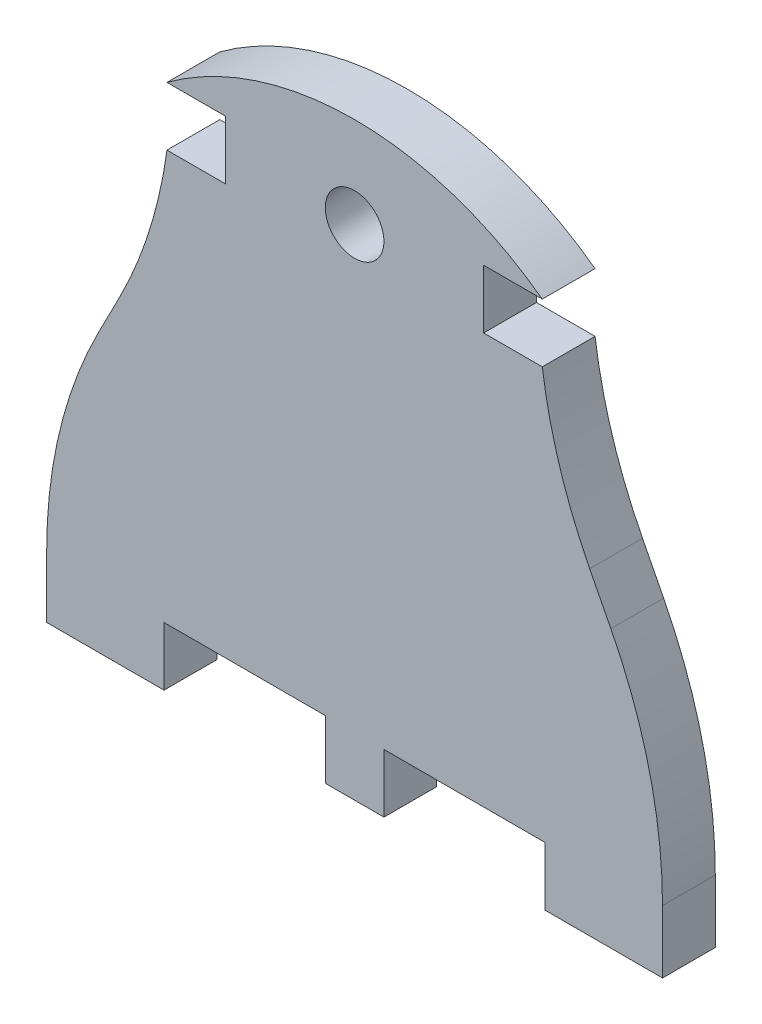
ISO-10303-21;
HEADER;
FILE_DESCRIPTION(('STEP AP214'),'2;1');
FILE_NAME('part.step','',(''),(''),'','','');
FILE_SCHEMA(('AUTOMOTIVE_DESIGN { 1 0 10303 214 1 1 1 1 }'));
ENDSEC;
DATA;
#1=APPLICATION_CONTEXT('core data for automotive mechanical design processes');
#2=APPLICATION_PROTOCOL_DEFINITION('international standard','automotive_design',2000,#1);
#3=PRODUCT_CONTEXT('',#1,'mechanical');
#4=PRODUCT('Part','Part','',(#3));
#5=PRODUCT_RELATED_PRODUCT_CATEGORY('part','',(#4));
#6=PRODUCT_DEFINITION_FORMATION('','',#4);
#7=PRODUCT_DEFINITION_CONTEXT('part definition',#1,'design');
#8=PRODUCT_DEFINITION('design','',#6,#7);
#9=PRODUCT_DEFINITION_SHAPE('','',#8);
#10=(LENGTH_UNIT() NAMED_UNIT(*) SI_UNIT(.MILLI.,.METRE.));
#11=(NAMED_UNIT(*) PLANE_ANGLE_UNIT() SI_UNIT($,.RADIAN.));
#12=(NAMED_UNIT(*) SI_UNIT($,.STERADIAN.) SOLID_ANGLE_UNIT());
#13=UNCERTAINTY_MEASURE_WITH_UNIT(LENGTH_MEASURE(1.E-05),#10,'distance_accuracy_value','');
#14=(GEOMETRIC_REPRESENTATION_CONTEXT(3) GLOBAL_UNCERTAINTY_ASSIGNED_CONTEXT((#13)) GLOBAL_UNIT_ASSIGNED_CONTEXT((#10,
#11,#12)) REPRESENTATION_CONTEXT('',''));
#15=CARTESIAN_POINT('',(0.,0.,0.));
#16=DIRECTION('',(0.,0.,1.));
#17=DIRECTION('',(1.,0.,0.));
#18=AXIS2_PLACEMENT_3D('',#15,#16,#17);
#19=CARTESIAN_POINT('',(0.,0.,4.5));
#20=DIRECTION('',(0.,0.,1.));
#21=DIRECTION('',(1.,0.,0.));
#22=AXIS2_PLACEMENT_3D('',#19,#20,#21);
#23=PLANE('',#22);
#24=CARTESIAN_POINT('',(0.,53.2123706585382,4.5));
#25=DIRECTION('',(0.,0.,1.));
#26=DIRECTION('',(1.,0.,0.));
#27=AXIS2_PLACEMENT_3D('',#24,#25,#26);
#28=CIRCLE('',#27,2.5);
#29=CARTESIAN_POINT('',(2.5,53.2123706585382,4.5));
#30=VERTEX_POINT('',#29);
#31=EDGE_CURVE('E285',#30,#30,#28,.T.);
#32=ORIENTED_EDGE('',*,*,#31,.F.);
#33=EDGE_LOOP('',(#32));
#34=FACE_BOUND('',#33,.T.);
#35=CARTESIAN_POINT('',(0.,33.9910697322237,4.5));
#36=DIRECTION('',(0.,0.,-1.));
#37=DIRECTION('',(-1.,0.,0.));
#38=AXIS2_PLACEMENT_3D('',#35,#36,#37);
#39=CIRCLE('',#38,26.9714919574501);
#40=CARTESIAN_POINT('',(-16.,55.7042311420875,4.5));
#41=VERTEX_POINT('',#40);
#42=CARTESIAN_POINT('',(16.,55.7042311420875,4.5));
#43=VERTEX_POINT('',#42);
#44=EDGE_CURVE('E200',#41,#43,#39,.T.);
#45=ORIENTED_EDGE('',*,*,#44,.F.);
#46=DIRECTION('',(-1.,0.,0.));
#47=VECTOR('',#46,1.);
#48=CARTESIAN_POINT('',(0.,55.7042311420875,4.5));
#49=LINE('',#48,#47);
#50=CARTESIAN_POINT('',(-11.,55.7042311420875,4.5));
#51=VERTEX_POINT('',#50);
#52=EDGE_CURVE('E214',#51,#41,#49,.T.);
#53=ORIENTED_EDGE('',*,*,#52,.F.);
#54=DIRECTION('',(0.,1.,0.));
#55=VECTOR('',#54,1.);
#56=CARTESIAN_POINT('',(-11.,0.,4.5));
#57=LINE('',#56,#55);
#58=CARTESIAN_POINT('',(-11.,50.7042311420875,4.5));
#59=VERTEX_POINT('',#58);
#60=EDGE_CURVE('E221',#59,#51,#57,.T.);
#61=ORIENTED_EDGE('',*,*,#60,.F.);
#62=DIRECTION('',(1.,0.,0.));
#63=VECTOR('',#62,1.);
#64=CARTESIAN_POINT('',(0.,50.7042311420875,4.5));
#65=LINE('',#64,#63);
#66=CARTESIAN_POINT('',(-16.,50.7042311420875,4.5));
#67=VERTEX_POINT('',#66);
#68=EDGE_CURVE('E223',#67,#59,#65,.T.);
#69=ORIENTED_EDGE('',*,*,#68,.F.);
#70=CARTESIAN_POINT('',(-55.63981281636,56.0600914729717,4.5));
#71=DIRECTION('',(0.,0.,1.));
#72=DIRECTION('',(1.,0.,0.));
#73=AXIS2_PLACEMENT_3D('',#70,#71,#72);
#74=CIRCLE('',#73,40.);
#75=CARTESIAN_POINT('',(-20.042482794085,37.8164598365558,4.5));
#76=VERTEX_POINT('',#75);
#77=EDGE_CURVE('E341',#67,#76,#74,.F.);
#78=ORIENTED_EDGE('',*,*,#77,.T.);
#79=DIRECTION('',(0.456090790910399,0.889933250556876,0.));
#80=VECTOR('',#79,1.);
#81=CARTESIAN_POINT('',(-31.2226058836836,16.0015855153878,4.5));
#82=LINE('',#81,#80);
#83=CARTESIAN_POINT('',(-21.847330022275,34.2948067083801,4.5));
#84=VERTEX_POINT('',#83);
#85=EDGE_CURVE('E231',#84,#76,#82,.T.);
#86=ORIENTED_EDGE('',*,*,#85,.F.);
#87=CARTESIAN_POINT('',(13.75,16.0511750719641,4.5));
#88=DIRECTION('',(0.,0.,1.));
#89=DIRECTION('',(1.,0.,0.));
#90=AXIS2_PLACEMENT_3D('',#87,#88,#89);
#91=CIRCLE('',#90,40.);
#92=CARTESIAN_POINT('',(-26.25,16.0511750719641,4.5));
#93=VERTEX_POINT('',#92);
#94=EDGE_CURVE('E330',#84,#93,#91,.T.);
#95=ORIENTED_EDGE('',*,*,#94,.T.);
#96=DIRECTION('',(0.,1.,0.));
#97=VECTOR('',#96,1.);
#98=CARTESIAN_POINT('',(-26.25,0.,4.5));
#99=LINE('',#98,#97);
#100=CARTESIAN_POINT('',(-26.25,10.7042311420875,4.5));
#101=VERTEX_POINT('',#100);
#102=EDGE_CURVE('E234',#101,#93,#99,.T.);
#103=ORIENTED_EDGE('',*,*,#102,.F.);
#104=DIRECTION('',(1.,0.,0.));
#105=VECTOR('',#104,1.);
#106=CARTESIAN_POINT('',(0.,10.7042311420875,4.5));
#107=LINE('',#106,#105);
#108=CARTESIAN_POINT('',(-16.25,10.7042311420875,4.5));
#109=VERTEX_POINT('',#108);
#110=EDGE_CURVE('E237',#101,#109,#107,.T.);
#111=ORIENTED_EDGE('',*,*,#110,.T.);
#112=DIRECTION('',(0.,1.,0.));
#113=VECTOR('',#112,1.);
#114=CARTESIAN_POINT('',(-16.25,0.,4.5));
#115=LINE('',#114,#113);
#116=CARTESIAN_POINT('',(-16.25,15.7042311420875,4.5));
#117=VERTEX_POINT('',#116);
#118=EDGE_CURVE('E378',#109,#117,#115,.T.);
#119=ORIENTED_EDGE('',*,*,#118,.T.);
#120=DIRECTION('',(1.,0.,0.));
#121=VECTOR('',#120,1.);
#122=CARTESIAN_POINT('',(0.,15.7042311420875,4.5));
#123=LINE('',#122,#121);
#124=CARTESIAN_POINT('',(-2.5,15.7042311420875,4.5));
#125=VERTEX_POINT('',#124);
#126=EDGE_CURVE('E376',#117,#125,#123,.T.);
#127=ORIENTED_EDGE('',*,*,#126,.T.);
#128=DIRECTION('',(0.,1.,0.));
#129=VECTOR('',#128,1.);
#130=CARTESIAN_POINT('',(-2.5,10.7042311420875,4.5));
#131=LINE('',#130,#129);
#132=CARTESIAN_POINT('',(-2.5,10.7042311420875,4.5));
#133=VERTEX_POINT('',#132);
#134=EDGE_CURVE('E384',#133,#125,#131,.T.);
#135=ORIENTED_EDGE('',*,*,#134,.F.);
#136=DIRECTION('',(-1.,0.,0.));
#137=VECTOR('',#136,1.);
#138=CARTESIAN_POINT('',(-2.5,10.7042311420875,4.5));
#139=LINE('',#138,#137);
#140=CARTESIAN_POINT('',(2.5,10.7042311420875,4.5));
#141=VERTEX_POINT('',#140);
#142=EDGE_CURVE('E402',#141,#133,#139,.T.);
#143=ORIENTED_EDGE('',*,*,#142,.F.);
#144=DIRECTION('',(0.,1.,0.));
#145=VECTOR('',#144,1.);
#146=CARTESIAN_POINT('',(2.5,10.7042311420875,4.5));
#147=LINE('',#146,#145);
#148=CARTESIAN_POINT('',(2.5,15.7042311420875,4.5));
#149=VERTEX_POINT('',#148);
#150=EDGE_CURVE('E244',#141,#149,#147,.T.);
#151=ORIENTED_EDGE('',*,*,#150,.T.);
#152=CARTESIAN_POINT('',(16.25,15.7042311420875,4.5));
#153=VERTEX_POINT('',#152);
#154=EDGE_CURVE('E52',#149,#153,#123,.T.);
#155=ORIENTED_EDGE('',*,*,#154,.T.);
#156=DIRECTION('',(0.,1.,0.));
#157=VECTOR('',#156,1.);
#158=CARTESIAN_POINT('',(16.25,0.,4.5));
#159=LINE('',#158,#157);
#160=CARTESIAN_POINT('',(16.25,10.7042311420875,4.5));
#161=VERTEX_POINT('',#160);
#162=EDGE_CURVE('E373',#161,#153,#159,.T.);
#163=ORIENTED_EDGE('',*,*,#162,.F.);
#164=DIRECTION('',(-1.,0.,0.));
#165=VECTOR('',#164,1.);
#166=CARTESIAN_POINT('',(0.,10.7042311420875,4.5));
#167=LINE('',#166,#165);
#168=CARTESIAN_POINT('',(26.25,10.7042311420875,4.5));
#169=VERTEX_POINT('',#168);
#170=EDGE_CURVE('E370',#169,#161,#167,.T.);
#171=ORIENTED_EDGE('',*,*,#170,.F.);
#172=DIRECTION('',(0.,1.,0.));
#173=VECTOR('',#172,1.);
#174=CARTESIAN_POINT('',(26.25,0.,4.5));
#175=LINE('',#174,#173);
#176=CARTESIAN_POINT('',(26.25,16.0511750719641,4.5));
#177=VERTEX_POINT('',#176);
#178=EDGE_CURVE('E365',#169,#177,#175,.T.);
#179=ORIENTED_EDGE('',*,*,#178,.T.);
#180=CARTESIAN_POINT('',(-13.75,16.0511750719641,4.5));
#181=DIRECTION('',(0.,0.,1.));
#182=DIRECTION('',(1.,0.,0.));
#183=AXIS2_PLACEMENT_3D('',#180,#181,#182);
#184=CIRCLE('',#183,40.);
#185=CARTESIAN_POINT('',(21.847330022275,34.2948067083801,4.5));
#186=VERTEX_POINT('',#185);
#187=EDGE_CURVE('E328',#177,#186,#184,.T.);
#188=ORIENTED_EDGE('',*,*,#187,.T.);
#189=DIRECTION('',(-0.456090790910399,0.889933250556876,0.));
#190=VECTOR('',#189,1.);
#191=CARTESIAN_POINT('',(31.2226058836836,16.0015855153878,4.5));
#192=LINE('',#191,#190);
#193=CARTESIAN_POINT('',(20.042482794085,37.8164598365558,4.5));
#194=VERTEX_POINT('',#193);
#195=EDGE_CURVE('E360',#186,#194,#192,.T.);
#196=ORIENTED_EDGE('',*,*,#195,.T.);
#197=CARTESIAN_POINT('',(55.63981281636,56.0600914729717,4.5));
#198=DIRECTION('',(0.,0.,1.));
#199=DIRECTION('',(1.,0.,0.));
#200=AXIS2_PLACEMENT_3D('',#197,#198,#199);
#201=CIRCLE('',#200,40.);
#202=CARTESIAN_POINT('',(16.,50.7042311420875,4.5));
#203=VERTEX_POINT('',#202);
#204=EDGE_CURVE('E11',#194,#203,#201,.F.);
#205=ORIENTED_EDGE('',*,*,#204,.T.);
#206=DIRECTION('',(-1.,0.,0.));
#207=VECTOR('',#206,1.);
#208=CARTESIAN_POINT('',(0.,50.7042311420875,4.5));
#209=LINE('',#208,#207);
#210=CARTESIAN_POINT('',(11.,50.7042311420875,4.5));
#211=VERTEX_POINT('',#210);
#212=EDGE_CURVE('E358',#203,#211,#209,.T.);
#213=ORIENTED_EDGE('',*,*,#212,.T.);
#214=DIRECTION('',(0.,1.,0.));
#215=VECTOR('',#214,1.);
#216=CARTESIAN_POINT('',(11.,0.,4.5));
#217=LINE('',#216,#215);
#218=CARTESIAN_POINT('',(11.,55.7042311420875,4.5));
#219=VERTEX_POINT('',#218);
#220=EDGE_CURVE('E225',#211,#219,#217,.T.);
#221=ORIENTED_EDGE('',*,*,#220,.T.);
#222=DIRECTION('',(1.,0.,0.));
#223=VECTOR('',#222,1.);
#224=CARTESIAN_POINT('',(0.,55.7042311420875,4.5));
#225=LINE('',#224,#223);
#226=EDGE_CURVE('E217',#219,#43,#225,.T.);
#227=ORIENTED_EDGE('',*,*,#226,.T.);
#228=EDGE_LOOP('',(#45,#53,#61,#69,#78,#86,#95,#103,#111,#119,#127,#135,#143,#151,#155,#163,
#171,#179,#188,#196,#205,#213,#221,#227));
#229=FACE_BOUND('',#228,.T.);
#230=ADVANCED_FACE('F37',(#34,#229),#23,.T.);
#231=CARTESIAN_POINT('',(0.,0.,0.));
#232=DIRECTION('',(0.,0.,1.));
#233=DIRECTION('',(1.,0.,0.));
#234=AXIS2_PLACEMENT_3D('',#231,#232,#233);
#235=PLANE('',#234);
#236=CARTESIAN_POINT('',(0.,53.2123706585382,0.));
#237=DIRECTION('',(0.,0.,1.));
#238=DIRECTION('',(1.,0.,0.));
#239=AXIS2_PLACEMENT_3D('',#236,#237,#238);
#240=CIRCLE('',#239,2.5);
#241=CARTESIAN_POINT('',(2.5,53.2123706585382,0.));
#242=VERTEX_POINT('',#241);
#243=EDGE_CURVE('E240',#242,#242,#240,.T.);
#244=ORIENTED_EDGE('',*,*,#243,.T.);
#245=EDGE_LOOP('',(#244));
#246=FACE_BOUND('',#245,.T.);
#247=DIRECTION('',(-1.,0.,0.));
#248=VECTOR('',#247,1.);
#249=CARTESIAN_POINT('',(0.,55.7042311420875,0.));
#250=LINE('',#249,#248);
#251=CARTESIAN_POINT('',(-11.,55.7042311420875,0.));
#252=VERTEX_POINT('',#251);
#253=CARTESIAN_POINT('',(-16.,55.7042311420875,0.));
#254=VERTEX_POINT('',#253);
#255=EDGE_CURVE('E269',#252,#254,#250,.T.);
#256=ORIENTED_EDGE('',*,*,#255,.T.);
#257=CARTESIAN_POINT('',(0.,33.9910697322237,0.));
#258=DIRECTION('',(0.,0.,1.));
#259=DIRECTION('',(1.,0.,0.));
#260=AXIS2_PLACEMENT_3D('',#257,#258,#259);
#261=CIRCLE('',#260,26.9714919574501);
#262=CARTESIAN_POINT('',(16.,55.7042311420874,0.));
#263=VERTEX_POINT('',#262);
#264=EDGE_CURVE('E203',#254,#263,#261,.F.);
#265=ORIENTED_EDGE('',*,*,#264,.T.);
#266=DIRECTION('',(1.,0.,0.));
#267=VECTOR('',#266,1.);
#268=CARTESIAN_POINT('',(0.,55.7042311420875,0.));
#269=LINE('',#268,#267);
#270=CARTESIAN_POINT('',(11.,55.7042311420875,0.));
#271=VERTEX_POINT('',#270);
#272=EDGE_CURVE('E266',#271,#263,#269,.T.);
#273=ORIENTED_EDGE('',*,*,#272,.F.);
#274=DIRECTION('',(0.,1.,0.));
#275=VECTOR('',#274,1.);
#276=CARTESIAN_POINT('',(11.,0.,0.));
#277=LINE('',#276,#275);
#278=CARTESIAN_POINT('',(11.,50.7042311420875,0.));
#279=VERTEX_POINT('',#278);
#280=EDGE_CURVE('E264',#279,#271,#277,.T.);
#281=ORIENTED_EDGE('',*,*,#280,.F.);
#282=DIRECTION('',(-1.,0.,0.));
#283=VECTOR('',#282,1.);
#284=CARTESIAN_POINT('',(0.,50.7042311420875,0.));
#285=LINE('',#284,#283);
#286=CARTESIAN_POINT('',(16.,50.7042311420875,0.));
#287=VERTEX_POINT('',#286);
#288=EDGE_CURVE('E262',#287,#279,#285,.T.);
#289=ORIENTED_EDGE('',*,*,#288,.F.);
#290=CARTESIAN_POINT('',(55.63981281636,56.0600914729717,0.));
#291=DIRECTION('',(0.,0.,1.));
#292=DIRECTION('',(1.,0.,0.));
#293=AXIS2_PLACEMENT_3D('',#290,#291,#292);
#294=CIRCLE('',#293,40.);
#295=CARTESIAN_POINT('',(20.042482794085,37.8164598365558,0.));
#296=VERTEX_POINT('',#295);
#297=EDGE_CURVE('E45',#287,#296,#294,.T.);
#298=ORIENTED_EDGE('',*,*,#297,.T.);
#299=DIRECTION('',(-0.456090790910399,0.889933250556876,0.));
#300=VECTOR('',#299,1.);
#301=CARTESIAN_POINT('',(31.2226058836836,16.0015855153878,0.));
#302=LINE('',#301,#300);
#303=CARTESIAN_POINT('',(21.847330022275,34.2948067083801,0.));
#304=VERTEX_POINT('',#303);
#305=EDGE_CURVE('E259',#304,#296,#302,.T.);
#306=ORIENTED_EDGE('',*,*,#305,.F.);
#307=CARTESIAN_POINT('',(-13.75,16.0511750719641,0.));
#308=DIRECTION('',(0.,0.,1.));
#309=DIRECTION('',(1.,0.,0.));
#310=AXIS2_PLACEMENT_3D('',#307,#308,#309);
#311=CIRCLE('',#310,40.);
#312=CARTESIAN_POINT('',(26.25,16.0511750719641,0.));
#313=VERTEX_POINT('',#312);
#314=EDGE_CURVE('E324',#304,#313,#311,.F.);
#315=ORIENTED_EDGE('',*,*,#314,.T.);
#316=DIRECTION('',(0.,1.,0.));
#317=VECTOR('',#316,1.);
#318=CARTESIAN_POINT('',(26.25,0.,0.));
#319=LINE('',#318,#317);
#320=CARTESIAN_POINT('',(26.25,10.7042311420875,0.));
#321=VERTEX_POINT('',#320);
#322=EDGE_CURVE('E256',#321,#313,#319,.T.);
#323=ORIENTED_EDGE('',*,*,#322,.F.);
#324=DIRECTION('',(-1.,0.,0.));
#325=VECTOR('',#324,1.);
#326=CARTESIAN_POINT('',(0.,10.7042311420875,0.));
#327=LINE('',#326,#325);
#328=CARTESIAN_POINT('',(16.25,10.7042311420875,0.));
#329=VERTEX_POINT('',#328);
#330=EDGE_CURVE('E253',#321,#329,#327,.T.);
#331=ORIENTED_EDGE('',*,*,#330,.T.);
#332=DIRECTION('',(0.,1.,0.));
#333=VECTOR('',#332,1.);
#334=CARTESIAN_POINT('',(16.25,0.,0.));
#335=LINE('',#334,#333);
#336=CARTESIAN_POINT('',(16.25,15.7042311420875,0.));
#337=VERTEX_POINT('',#336);
#338=EDGE_CURVE('E250',#329,#337,#335,.T.);
#339=ORIENTED_EDGE('',*,*,#338,.T.);
#340=DIRECTION('',(1.,0.,0.));
#341=VECTOR('',#340,1.);
#342=CARTESIAN_POINT('',(0.,15.7042311420875,0.));
#343=LINE('',#342,#341);
#344=CARTESIAN_POINT('',(2.5,15.7042311420875,0.));
#345=VERTEX_POINT('',#344);
#346=EDGE_CURVE('E247',#345,#337,#343,.T.);
#347=ORIENTED_EDGE('',*,*,#346,.F.);
#348=DIRECTION('',(0.,1.,0.));
#349=VECTOR('',#348,1.);
#350=CARTESIAN_POINT('',(2.5,10.7042311420875,0.));
#351=LINE('',#350,#349);
#352=CARTESIAN_POINT('',(2.5,10.7042311420875,0.));
#353=VERTEX_POINT('',#352);
#354=EDGE_CURVE('E390',#353,#345,#351,.T.);
#355=ORIENTED_EDGE('',*,*,#354,.F.);
#356=DIRECTION('',(1.,0.,0.));
#357=VECTOR('',#356,1.);
#358=CARTESIAN_POINT('',(-2.5,10.7042311420875,0.));
#359=LINE('',#358,#357);
#360=CARTESIAN_POINT('',(-2.5,10.7042311420875,0.));
#361=VERTEX_POINT('',#360);
#362=EDGE_CURVE('E393',#361,#353,#359,.T.);
#363=ORIENTED_EDGE('',*,*,#362,.F.);
#364=DIRECTION('',(0.,1.,0.));
#365=VECTOR('',#364,1.);
#366=CARTESIAN_POINT('',(-2.5,10.7042311420875,0.));
#367=LINE('',#366,#365);
#368=CARTESIAN_POINT('',(-2.5,15.7042311420875,0.));
#369=VERTEX_POINT('',#368);
#370=EDGE_CURVE('E387',#361,#369,#367,.T.);
#371=ORIENTED_EDGE('',*,*,#370,.T.);
#372=CARTESIAN_POINT('',(-16.25,15.7042311420875,0.));
#373=VERTEX_POINT('',#372);
#374=EDGE_CURVE('E248',#373,#369,#343,.T.);
#375=ORIENTED_EDGE('',*,*,#374,.F.);
#376=DIRECTION('',(0.,1.,0.));
#377=VECTOR('',#376,1.);
#378=CARTESIAN_POINT('',(-16.25,0.,0.));
#379=LINE('',#378,#377);
#380=CARTESIAN_POINT('',(-16.25,10.7042311420875,0.));
#381=VERTEX_POINT('',#380);
#382=EDGE_CURVE('E243',#381,#373,#379,.T.);
#383=ORIENTED_EDGE('',*,*,#382,.F.);
#384=DIRECTION('',(1.,0.,0.));
#385=VECTOR('',#384,1.);
#386=CARTESIAN_POINT('',(0.,10.7042311420875,0.));
#387=LINE('',#386,#385);
#388=CARTESIAN_POINT('',(-26.25,10.7042311420875,0.));
#389=VERTEX_POINT('',#388);
#390=EDGE_CURVE('E283',#389,#381,#387,.T.);
#391=ORIENTED_EDGE('',*,*,#390,.F.);
#392=DIRECTION('',(0.,1.,0.));
#393=VECTOR('',#392,1.);
#394=CARTESIAN_POINT('',(-26.25,0.,0.));
#395=LINE('',#394,#393);
#396=CARTESIAN_POINT('',(-26.25,16.0511750719641,0.));
#397=VERTEX_POINT('',#396);
#398=EDGE_CURVE('E280',#389,#397,#395,.T.);
#399=ORIENTED_EDGE('',*,*,#398,.T.);
#400=CARTESIAN_POINT('',(13.75,16.0511750719641,0.));
#401=DIRECTION('',(0.,0.,1.));
#402=DIRECTION('',(1.,0.,0.));
#403=AXIS2_PLACEMENT_3D('',#400,#401,#402);
#404=CIRCLE('',#403,40.);
#405=CARTESIAN_POINT('',(-21.847330022275,34.2948067083801,0.));
#406=VERTEX_POINT('',#405);
#407=EDGE_CURVE('E326',#397,#406,#404,.F.);
#408=ORIENTED_EDGE('',*,*,#407,.T.);
#409=DIRECTION('',(0.456090790910399,0.889933250556876,0.));
#410=VECTOR('',#409,1.);
#411=CARTESIAN_POINT('',(-31.2226058836836,16.0015855153878,0.));
#412=LINE('',#411,#410);
#413=CARTESIAN_POINT('',(-20.042482794085,37.8164598365558,0.));
#414=VERTEX_POINT('',#413);
#415=EDGE_CURVE('E277',#406,#414,#412,.T.);
#416=ORIENTED_EDGE('',*,*,#415,.T.);
#417=CARTESIAN_POINT('',(-55.63981281636,56.0600914729717,0.));
#418=DIRECTION('',(0.,0.,1.));
#419=DIRECTION('',(1.,0.,0.));
#420=AXIS2_PLACEMENT_3D('',#417,#418,#419);
#421=CIRCLE('',#420,40.);
#422=CARTESIAN_POINT('',(-16.,50.7042311420875,0.));
#423=VERTEX_POINT('',#422);
#424=EDGE_CURVE('E339',#414,#423,#421,.T.);
#425=ORIENTED_EDGE('',*,*,#424,.T.);
#426=DIRECTION('',(1.,0.,0.));
#427=VECTOR('',#426,1.);
#428=CARTESIAN_POINT('',(0.,50.7042311420875,0.));
#429=LINE('',#428,#427);
#430=CARTESIAN_POINT('',(-11.,50.7042311420875,0.));
#431=VERTEX_POINT('',#430);
#432=EDGE_CURVE('E274',#423,#431,#429,.T.);
#433=ORIENTED_EDGE('',*,*,#432,.T.);
#434=DIRECTION('',(0.,1.,0.));
#435=VECTOR('',#434,1.);
#436=CARTESIAN_POINT('',(-11.,0.,0.));
#437=LINE('',#436,#435);
#438=EDGE_CURVE('E271',#431,#252,#437,.T.);
#439=ORIENTED_EDGE('',*,*,#438,.T.);
#440=EDGE_LOOP('',(#256,#265,#273,#281,#289,#298,#306,#315,#323,#331,#339,#347,#355,#363,#371,
#375,#383,#391,#399,#408,#416,#425,#433,#439));
#441=FACE_BOUND('',#440,.T.);
#442=ADVANCED_FACE('F345',(#246,#441),#235,.F.);
#443=CARTESIAN_POINT('',(0.,15.7042311420875,4.5));
#444=DIRECTION('',(0.,1.,0.));
#445=DIRECTION('',(0.,0.,1.));
#446=AXIS2_PLACEMENT_3D('',#443,#444,#445);
#447=PLANE('',#446);
#448=DIRECTION('',(0.,0.,1.));
#449=VECTOR('',#448,1.);
#450=CARTESIAN_POINT('',(2.5,15.7042311420875,0.));
#451=LINE('',#450,#449);
#452=EDGE_CURVE('E396',#345,#149,#451,.T.);
#453=ORIENTED_EDGE('',*,*,#452,.F.);
#454=ORIENTED_EDGE('',*,*,#346,.T.);
#455=DIRECTION('',(0.,0.,-1.));
#456=VECTOR('',#455,1.);
#457=CARTESIAN_POINT('',(16.25,15.7042311420875,4.5));
#458=LINE('',#457,#456);
#459=EDGE_CURVE('E310',#153,#337,#458,.T.);
#460=ORIENTED_EDGE('',*,*,#459,.F.);
#461=ORIENTED_EDGE('',*,*,#154,.F.);
#462=EDGE_LOOP('',(#453,#454,#460,#461));
#463=FACE_BOUND('',#462,.T.);
#464=ADVANCED_FACE('F426',(#463),#447,.F.);
#465=DIRECTION('',(0.,0.,-1.));
#466=VECTOR('',#465,1.);
#467=CARTESIAN_POINT('',(-2.5,15.7042311420875,0.));
#468=LINE('',#467,#466);
#469=EDGE_CURVE('E60',#125,#369,#468,.T.);
#470=ORIENTED_EDGE('',*,*,#469,.F.);
#471=ORIENTED_EDGE('',*,*,#126,.F.);
#472=DIRECTION('',(0.,0.,-1.));
#473=VECTOR('',#472,1.);
#474=CARTESIAN_POINT('',(-16.25,15.7042311420875,4.5));
#475=LINE('',#474,#473);
#476=EDGE_CURVE('E313',#117,#373,#475,.T.);
#477=ORIENTED_EDGE('',*,*,#476,.T.);
#478=ORIENTED_EDGE('',*,*,#374,.T.);
#479=EDGE_LOOP('',(#470,#471,#477,#478));
#480=FACE_BOUND('',#479,.T.);
#481=ADVANCED_FACE('F600',(#480),#447,.F.);
#482=CARTESIAN_POINT('',(-16.25,0.,4.5));
#483=DIRECTION('',(-1.,0.,0.));
#484=DIRECTION('',(0.,0.,1.));
#485=AXIS2_PLACEMENT_3D('',#482,#483,#484);
#486=PLANE('',#485);
#487=ORIENTED_EDGE('',*,*,#382,.T.);
#488=ORIENTED_EDGE('',*,*,#476,.F.);
#489=ORIENTED_EDGE('',*,*,#118,.F.);
#490=DIRECTION('',(0.,0.,-1.));
#491=VECTOR('',#490,1.);
#492=CARTESIAN_POINT('',(-16.25,10.7042311420875,4.5));
#493=LINE('',#492,#491);
#494=EDGE_CURVE('E239',#109,#381,#493,.T.);
#495=ORIENTED_EDGE('',*,*,#494,.T.);
#496=EDGE_LOOP('',(#487,#488,#489,#495));
#497=FACE_BOUND('',#496,.T.);
#498=ADVANCED_FACE('F605',(#497),#486,.F.);
#499=CARTESIAN_POINT('',(16.25,0.,4.5));
#500=DIRECTION('',(-1.,0.,0.));
#501=DIRECTION('',(0.,0.,1.));
#502=AXIS2_PLACEMENT_3D('',#499,#500,#501);
#503=PLANE('',#502);
#504=ORIENTED_EDGE('',*,*,#338,.F.);
#505=DIRECTION('',(0.,0.,-1.));
#506=VECTOR('',#505,1.);
#507=CARTESIAN_POINT('',(16.25,10.7042311420875,4.5));
#508=LINE('',#507,#506);
#509=EDGE_CURVE('E308',#161,#329,#508,.T.);
#510=ORIENTED_EDGE('',*,*,#509,.F.);
#511=ORIENTED_EDGE('',*,*,#162,.T.);
#512=ORIENTED_EDGE('',*,*,#459,.T.);
#513=EDGE_LOOP('',(#504,#510,#511,#512));
#514=FACE_BOUND('',#513,.T.);
#515=ADVANCED_FACE('F646',(#514),#503,.T.);
#516=CARTESIAN_POINT('',(0.,10.7042311420875,4.5));
#517=DIRECTION('',(0.,-1.,0.));
#518=DIRECTION('',(0.,0.,-1.));
#519=AXIS2_PLACEMENT_3D('',#516,#517,#518);
#520=PLANE('',#519);
#521=ORIENTED_EDGE('',*,*,#330,.F.);
#522=DIRECTION('',(0.,0.,-1.));
#523=VECTOR('',#522,1.);
#524=CARTESIAN_POINT('',(26.25,10.7042311420875,4.5));
#525=LINE('',#524,#523);
#526=EDGE_CURVE('E306',#169,#321,#525,.T.);
#527=ORIENTED_EDGE('',*,*,#526,.F.);
#528=ORIENTED_EDGE('',*,*,#170,.T.);
#529=ORIENTED_EDGE('',*,*,#509,.T.);
#530=EDGE_LOOP('',(#521,#527,#528,#529));
#531=FACE_BOUND('',#530,.T.);
#532=ADVANCED_FACE('F654',(#531),#520,.T.);
#533=CARTESIAN_POINT('',(26.25,0.,4.5));
#534=DIRECTION('',(-1.,0.,0.));
#535=DIRECTION('',(0.,0.,1.));
#536=AXIS2_PLACEMENT_3D('',#533,#534,#535);
#537=PLANE('',#536);
#538=ORIENTED_EDGE('',*,*,#322,.T.);
#539=DIRECTION('',(0.,0.,-1.));
#540=VECTOR('',#539,1.);
#541=CARTESIAN_POINT('',(26.25,16.0511750719641,4.5));
#542=LINE('',#541,#540);
#543=EDGE_CURVE('E337',#313,#177,#542,.F.);
#544=ORIENTED_EDGE('',*,*,#543,.T.);
#545=ORIENTED_EDGE('',*,*,#178,.F.);
#546=ORIENTED_EDGE('',*,*,#526,.T.);
#547=EDGE_LOOP('',(#538,#544,#545,#546));
#548=FACE_BOUND('',#547,.T.);
#549=ADVANCED_FACE('F662',(#548),#537,.F.);
#550=CARTESIAN_POINT('',(31.2226058836836,16.0015855153878,4.5));
#551=DIRECTION('',(-0.889933250556876,-0.456090790910399,0.));
#552=DIRECTION('',(0.456090790910399,-0.889933250556876,0.));
#553=AXIS2_PLACEMENT_3D('',#550,#551,#552);
#554=PLANE('',#553);
#555=ORIENTED_EDGE('',*,*,#305,.T.);
#556=DIRECTION('',(0.,0.,1.));
#557=VECTOR('',#556,1.);
#558=CARTESIAN_POINT('',(20.042482794085,37.8164598365558,4.5));
#559=LINE('',#558,#557);
#560=EDGE_CURVE('E335',#296,#194,#559,.T.);
#561=ORIENTED_EDGE('',*,*,#560,.T.);
#562=ORIENTED_EDGE('',*,*,#195,.F.);
#563=DIRECTION('',(0.,0.,-1.));
#564=VECTOR('',#563,1.);
#565=CARTESIAN_POINT('',(21.847330022275,34.2948067083801,4.5));
#566=LINE('',#565,#564);
#567=EDGE_CURVE('E332',#186,#304,#566,.T.);
#568=ORIENTED_EDGE('',*,*,#567,.T.);
#569=EDGE_LOOP('',(#555,#561,#562,#568));
#570=FACE_BOUND('',#569,.T.);
#571=ADVANCED_FACE('F351',(#570),#554,.F.);
#572=CARTESIAN_POINT('',(0.,50.7042311420875,4.5));
#573=DIRECTION('',(0.,-1.,0.));
#574=DIRECTION('',(0.,0.,-1.));
#575=AXIS2_PLACEMENT_3D('',#572,#573,#574);
#576=PLANE('',#575);
#577=ORIENTED_EDGE('',*,*,#288,.T.);
#578=DIRECTION('',(0.,0.,-1.));
#579=VECTOR('',#578,1.);
#580=CARTESIAN_POINT('',(11.,50.7042311420875,4.5));
#581=LINE('',#580,#579);
#582=EDGE_CURVE('E300',#211,#279,#581,.T.);
#583=ORIENTED_EDGE('',*,*,#582,.F.);
#584=ORIENTED_EDGE('',*,*,#212,.F.);
#585=DIRECTION('',(0.,0.,-1.));
#586=VECTOR('',#585,1.);
#587=CARTESIAN_POINT('',(16.,50.7042311420875,4.5));
#588=LINE('',#587,#586);
#589=EDGE_CURVE('E303',#203,#287,#588,.T.);
#590=ORIENTED_EDGE('',*,*,#589,.T.);
#591=EDGE_LOOP('',(#577,#583,#584,#590));
#592=FACE_BOUND('',#591,.T.);
#593=ADVANCED_FACE('F362',(#592),#576,.F.);
#594=CARTESIAN_POINT('',(11.,0.,4.5));
#595=DIRECTION('',(-1.,0.,0.));
#596=DIRECTION('',(0.,-1.,0.));
#597=AXIS2_PLACEMENT_3D('',#594,#595,#596);
#598=PLANE('',#597);
#599=ORIENTED_EDGE('',*,*,#280,.T.);
#600=DIRECTION('',(0.,0.,-1.));
#601=VECTOR('',#600,1.);
#602=CARTESIAN_POINT('',(11.,55.7042311420875,4.5));
#603=LINE('',#602,#601);
#604=EDGE_CURVE('E297',#219,#271,#603,.T.);
#605=ORIENTED_EDGE('',*,*,#604,.F.);
#606=ORIENTED_EDGE('',*,*,#220,.F.);
#607=ORIENTED_EDGE('',*,*,#582,.T.);
#608=EDGE_LOOP('',(#599,#605,#606,#607));
#609=FACE_BOUND('',#608,.T.);
#610=ADVANCED_FACE('F411',(#609),#598,.F.);
#611=CARTESIAN_POINT('',(0.,55.7042311420875,4.5));
#612=DIRECTION('',(0.,1.,0.));
#613=DIRECTION('',(0.,0.,1.));
#614=AXIS2_PLACEMENT_3D('',#611,#612,#613);
#615=PLANE('',#614);
#616=ORIENTED_EDGE('',*,*,#272,.T.);
#617=DIRECTION('',(0.,0.,-1.));
#618=VECTOR('',#617,1.);
#619=CARTESIAN_POINT('',(16.,55.7042311420875,4.5));
#620=LINE('',#619,#618);
#621=EDGE_CURVE('E208',#43,#263,#620,.T.);
#622=ORIENTED_EDGE('',*,*,#621,.F.);
#623=ORIENTED_EDGE('',*,*,#226,.F.);
#624=ORIENTED_EDGE('',*,*,#604,.T.);
#625=EDGE_LOOP('',(#616,#622,#623,#624));
#626=FACE_BOUND('',#625,.T.);
#627=ADVANCED_FACE('F408',(#626),#615,.F.);
#628=CARTESIAN_POINT('',(0.,55.7042311420875,4.5));
#629=DIRECTION('',(0.,-1.,0.));
#630=DIRECTION('',(0.,0.,-1.));
#631=AXIS2_PLACEMENT_3D('',#628,#629,#630);
#632=PLANE('',#631);
#633=ORIENTED_EDGE('',*,*,#255,.F.);
#634=DIRECTION('',(0.,0.,-1.));
#635=VECTOR('',#634,1.);
#636=CARTESIAN_POINT('',(-11.,55.7042311420875,4.5));
#637=LINE('',#636,#635);
#638=EDGE_CURVE('E209',#51,#252,#637,.T.);
#639=ORIENTED_EDGE('',*,*,#638,.F.);
#640=ORIENTED_EDGE('',*,*,#52,.T.);
#641=DIRECTION('',(0.,0.,-1.));
#642=VECTOR('',#641,1.);
#643=CARTESIAN_POINT('',(-16.,55.7042311420875,4.5));
#644=LINE('',#643,#642);
#645=EDGE_CURVE('E197',#41,#254,#644,.T.);
#646=ORIENTED_EDGE('',*,*,#645,.T.);
#647=EDGE_LOOP('',(#633,#639,#640,#646));
#648=FACE_BOUND('',#647,.T.);
#649=ADVANCED_FACE('F220',(#648),#632,.T.);
#650=CARTESIAN_POINT('',(-11.,0.,4.5));
#651=DIRECTION('',(-1.,0.,0.));
#652=DIRECTION('',(0.,-1.,0.));
#653=AXIS2_PLACEMENT_3D('',#650,#651,#652);
#654=PLANE('',#653);
#655=ORIENTED_EDGE('',*,*,#438,.F.);
#656=DIRECTION('',(0.,0.,-1.));
#657=VECTOR('',#656,1.);
#658=CARTESIAN_POINT('',(-11.,50.7042311420875,4.5));
#659=LINE('',#658,#657);
#660=EDGE_CURVE('E293',#59,#431,#659,.T.);
#661=ORIENTED_EDGE('',*,*,#660,.F.);
#662=ORIENTED_EDGE('',*,*,#60,.T.);
#663=ORIENTED_EDGE('',*,*,#638,.T.);
#664=EDGE_LOOP('',(#655,#661,#662,#663));
#665=FACE_BOUND('',#664,.T.);
#666=ADVANCED_FACE('F451',(#665),#654,.T.);
#667=CARTESIAN_POINT('',(0.,50.7042311420875,4.5));
#668=DIRECTION('',(0.,1.,0.));
#669=DIRECTION('',(0.,0.,1.));
#670=AXIS2_PLACEMENT_3D('',#667,#668,#669);
#671=PLANE('',#670);
#672=ORIENTED_EDGE('',*,*,#432,.F.);
#673=DIRECTION('',(0.,0.,-1.));
#674=VECTOR('',#673,1.);
#675=CARTESIAN_POINT('',(-16.,50.7042311420875,4.5));
#676=LINE('',#675,#674);
#677=EDGE_CURVE('E290',#67,#423,#676,.T.);
#678=ORIENTED_EDGE('',*,*,#677,.F.);
#679=ORIENTED_EDGE('',*,*,#68,.T.);
#680=ORIENTED_EDGE('',*,*,#660,.T.);
#681=EDGE_LOOP('',(#672,#678,#679,#680));
#682=FACE_BOUND('',#681,.T.);
#683=ADVANCED_FACE('F447',(#682),#671,.T.);
#684=CARTESIAN_POINT('',(-31.2226058836836,16.0015855153878,4.5));
#685=DIRECTION('',(-0.889933250556876,0.456090790910399,0.));
#686=DIRECTION('',(-0.456090790910399,-0.889933250556876,0.));
#687=AXIS2_PLACEMENT_3D('',#684,#685,#686);
#688=PLANE('',#687);
#689=ORIENTED_EDGE('',*,*,#85,.T.);
#690=DIRECTION('',(0.,0.,1.));
#691=VECTOR('',#690,1.);
#692=CARTESIAN_POINT('',(-20.042482794085,37.8164598365558,0.));
#693=LINE('',#692,#691);
#694=EDGE_CURVE('E318',#76,#414,#693,.F.);
#695=ORIENTED_EDGE('',*,*,#694,.T.);
#696=ORIENTED_EDGE('',*,*,#415,.F.);
#697=DIRECTION('',(0.,0.,-1.));
#698=VECTOR('',#697,1.);
#699=CARTESIAN_POINT('',(-21.847330022275,34.2948067083801,4.5));
#700=LINE('',#699,#698);
#701=EDGE_CURVE('E316',#406,#84,#700,.F.);
#702=ORIENTED_EDGE('',*,*,#701,.T.);
#703=EDGE_LOOP('',(#689,#695,#696,#702));
#704=FACE_BOUND('',#703,.T.);
#705=ADVANCED_FACE('F443',(#704),#688,.T.);
#706=CARTESIAN_POINT('',(-26.25,0.,4.5));
#707=DIRECTION('',(-1.,0.,0.));
#708=DIRECTION('',(0.,0.,1.));
#709=AXIS2_PLACEMENT_3D('',#706,#707,#708);
#710=PLANE('',#709);
#711=ORIENTED_EDGE('',*,*,#102,.T.);
#712=DIRECTION('',(0.,0.,-1.));
#713=VECTOR('',#712,1.);
#714=CARTESIAN_POINT('',(-26.25,16.0511750719641,4.5));
#715=LINE('',#714,#713);
#716=EDGE_CURVE('E321',#93,#397,#715,.T.);
#717=ORIENTED_EDGE('',*,*,#716,.T.);
#718=ORIENTED_EDGE('',*,*,#398,.F.);
#719=DIRECTION('',(0.,0.,-1.));
#720=VECTOR('',#719,1.);
#721=CARTESIAN_POINT('',(-26.25,10.7042311420875,4.5));
#722=LINE('',#721,#720);
#723=EDGE_CURVE('E288',#101,#389,#722,.T.);
#724=ORIENTED_EDGE('',*,*,#723,.F.);
#725=EDGE_LOOP('',(#711,#717,#718,#724));
#726=FACE_BOUND('',#725,.T.);
#727=ADVANCED_FACE('F440',(#726),#710,.T.);
#728=CARTESIAN_POINT('',(0.,53.2123706585382,4.5));
#729=DIRECTION('',(0.,0.,-1.));
#730=DIRECTION('',(-1.,0.,0.));
#731=AXIS2_PLACEMENT_3D('',#728,#729,#730);
#732=CYLINDRICAL_SURFACE('',#731,2.5);
#733=ORIENTED_EDGE('',*,*,#31,.T.);
#734=EDGE_LOOP('',(#733));
#735=FACE_BOUND('',#734,.T.);
#736=ORIENTED_EDGE('',*,*,#243,.F.);
#737=EDGE_LOOP('',(#736));
#738=FACE_BOUND('',#737,.T.);
#739=ADVANCED_FACE('F438',(#735,#738),#732,.F.);
#740=CARTESIAN_POINT('',(0.,10.7042311420875,4.5));
#741=DIRECTION('',(0.,1.,0.));
#742=DIRECTION('',(0.,0.,1.));
#743=AXIS2_PLACEMENT_3D('',#740,#741,#742);
#744=PLANE('',#743);
#745=ORIENTED_EDGE('',*,*,#390,.T.);
#746=ORIENTED_EDGE('',*,*,#494,.F.);
#747=ORIENTED_EDGE('',*,*,#110,.F.);
#748=ORIENTED_EDGE('',*,*,#723,.T.);
#749=EDGE_LOOP('',(#745,#746,#747,#748));
#750=FACE_BOUND('',#749,.T.);
#751=ADVANCED_FACE('F434',(#750),#744,.F.);
#752=CARTESIAN_POINT('',(-55.63981281636,56.0600914729717,4.5));
#753=DIRECTION('',(0.,0.,-1.));
#754=DIRECTION('',(-1.,0.,0.));
#755=AXIS2_PLACEMENT_3D('',#752,#753,#754);
#756=CYLINDRICAL_SURFACE('',#755,40.);
#757=ORIENTED_EDGE('',*,*,#77,.F.);
#758=ORIENTED_EDGE('',*,*,#677,.T.);
#759=ORIENTED_EDGE('',*,*,#424,.F.);
#760=ORIENTED_EDGE('',*,*,#694,.F.);
#761=EDGE_LOOP('',(#757,#758,#759,#760));
#762=FACE_BOUND('',#761,.T.);
#763=ADVANCED_FACE('F437',(#762),#756,.F.);
#764=CARTESIAN_POINT('',(13.75,16.0511750719641,4.5));
#765=DIRECTION('',(0.,0.,-1.));
#766=DIRECTION('',(-1.,0.,0.));
#767=AXIS2_PLACEMENT_3D('',#764,#765,#766);
#768=CYLINDRICAL_SURFACE('',#767,40.);
#769=ORIENTED_EDGE('',*,*,#94,.F.);
#770=ORIENTED_EDGE('',*,*,#701,.F.);
#771=ORIENTED_EDGE('',*,*,#407,.F.);
#772=ORIENTED_EDGE('',*,*,#716,.F.);
#773=EDGE_LOOP('',(#769,#770,#771,#772));
#774=FACE_BOUND('',#773,.T.);
#775=ADVANCED_FACE('F497',(#774),#768,.T.);
#776=CARTESIAN_POINT('',(55.63981281636,56.0600914729717,4.5));
#777=DIRECTION('',(0.,0.,1.));
#778=DIRECTION('',(1.,0.,0.));
#779=AXIS2_PLACEMENT_3D('',#776,#777,#778);
#780=CYLINDRICAL_SURFACE('',#779,40.);
#781=ORIENTED_EDGE('',*,*,#204,.F.);
#782=ORIENTED_EDGE('',*,*,#560,.F.);
#783=ORIENTED_EDGE('',*,*,#297,.F.);
#784=ORIENTED_EDGE('',*,*,#589,.F.);
#785=EDGE_LOOP('',(#781,#782,#783,#784));
#786=FACE_BOUND('',#785,.T.);
#787=ADVANCED_FACE('F356',(#786),#780,.F.);
#788=CARTESIAN_POINT('',(-13.75,16.0511750719641,4.5));
#789=DIRECTION('',(0.,0.,-1.));
#790=DIRECTION('',(-1.,0.,0.));
#791=AXIS2_PLACEMENT_3D('',#788,#789,#790);
#792=CYLINDRICAL_SURFACE('',#791,40.);
#793=ORIENTED_EDGE('',*,*,#187,.F.);
#794=ORIENTED_EDGE('',*,*,#543,.F.);
#795=ORIENTED_EDGE('',*,*,#314,.F.);
#796=ORIENTED_EDGE('',*,*,#567,.F.);
#797=EDGE_LOOP('',(#793,#794,#795,#796));
#798=FACE_BOUND('',#797,.T.);
#799=ADVANCED_FACE('F39',(#798),#792,.T.);
#800=CARTESIAN_POINT('',(2.5,10.7042311420875,0.));
#801=DIRECTION('',(-1.,0.,0.));
#802=DIRECTION('',(0.,0.,1.));
#803=AXIS2_PLACEMENT_3D('',#800,#801,#802);
#804=PLANE('',#803);
#805=ORIENTED_EDGE('',*,*,#452,.T.);
#806=ORIENTED_EDGE('',*,*,#150,.F.);
#807=DIRECTION('',(0.,0.,1.));
#808=VECTOR('',#807,1.);
#809=CARTESIAN_POINT('',(2.5,10.7042311420875,0.));
#810=LINE('',#809,#808);
#811=EDGE_CURVE('E395',#353,#141,#810,.T.);
#812=ORIENTED_EDGE('',*,*,#811,.F.);
#813=ORIENTED_EDGE('',*,*,#354,.T.);
#814=EDGE_LOOP('',(#805,#806,#812,#813));
#815=FACE_BOUND('',#814,.T.);
#816=ADVANCED_FACE('F431',(#815),#804,.F.);
#817=CARTESIAN_POINT('',(-2.5,10.7042311420875,0.));
#818=DIRECTION('',(1.,0.,0.));
#819=DIRECTION('',(0.,0.,-1.));
#820=AXIS2_PLACEMENT_3D('',#817,#818,#819);
#821=PLANE('',#820);
#822=ORIENTED_EDGE('',*,*,#469,.T.);
#823=ORIENTED_EDGE('',*,*,#370,.F.);
#824=DIRECTION('',(0.,0.,-1.));
#825=VECTOR('',#824,1.);
#826=CARTESIAN_POINT('',(-2.5,10.7042311420875,0.));
#827=LINE('',#826,#825);
#828=EDGE_CURVE('E400',#133,#361,#827,.T.);
#829=ORIENTED_EDGE('',*,*,#828,.F.);
#830=ORIENTED_EDGE('',*,*,#134,.T.);
#831=EDGE_LOOP('',(#822,#823,#829,#830));
#832=FACE_BOUND('',#831,.T.);
#833=ADVANCED_FACE('F524',(#832),#821,.F.);
#834=CARTESIAN_POINT('',(0.,10.7042311420875,0.));
#835=DIRECTION('',(0.,1.,0.));
#836=DIRECTION('',(0.,0.,1.));
#837=AXIS2_PLACEMENT_3D('',#834,#835,#836);
#838=PLANE('',#837);
#839=ORIENTED_EDGE('',*,*,#811,.T.);
#840=ORIENTED_EDGE('',*,*,#142,.T.);
#841=ORIENTED_EDGE('',*,*,#828,.T.);
#842=ORIENTED_EDGE('',*,*,#362,.T.);
#843=EDGE_LOOP('',(#839,#840,#841,#842));
#844=FACE_BOUND('',#843,.T.);
#845=ADVANCED_FACE('F532',(#844),#838,.F.);
#846=CARTESIAN_POINT('',(0.,33.9910697322237,-5.5));
#847=DIRECTION('',(0.,0.,1.));
#848=DIRECTION('',(1.,0.,0.));
#849=AXIS2_PLACEMENT_3D('',#846,#847,#848);
#850=CYLINDRICAL_SURFACE('',#849,26.9714919574501);
#851=ORIENTED_EDGE('',*,*,#645,.F.);
#852=ORIENTED_EDGE('',*,*,#44,.T.);
#853=ORIENTED_EDGE('',*,*,#621,.T.);
#854=ORIENTED_EDGE('',*,*,#264,.F.);
#855=EDGE_LOOP('',(#851,#852,#853,#854));
#856=FACE_BOUND('',#855,.T.);
#857=ADVANCED_FACE('F199',(#856),#850,.T.);
#858=CLOSED_SHELL('',(#230,#442,#464,#481,#498,#515,#532,#549,#571,#593,#610,#627,#649,#666,
#683,#705,#727,#739,#751,#763,#775,#787,#799,#816,#833,#845,#857));
#859=MANIFOLD_SOLID_BREP('B2',#858);
#860=ADVANCED_BREP_SHAPE_REPRESENTATION('',(#18,#859),#14);
#861=SHAPE_DEFINITION_REPRESENTATION(#9,#860);
ENDSEC;
END-ISO-10303-21;
